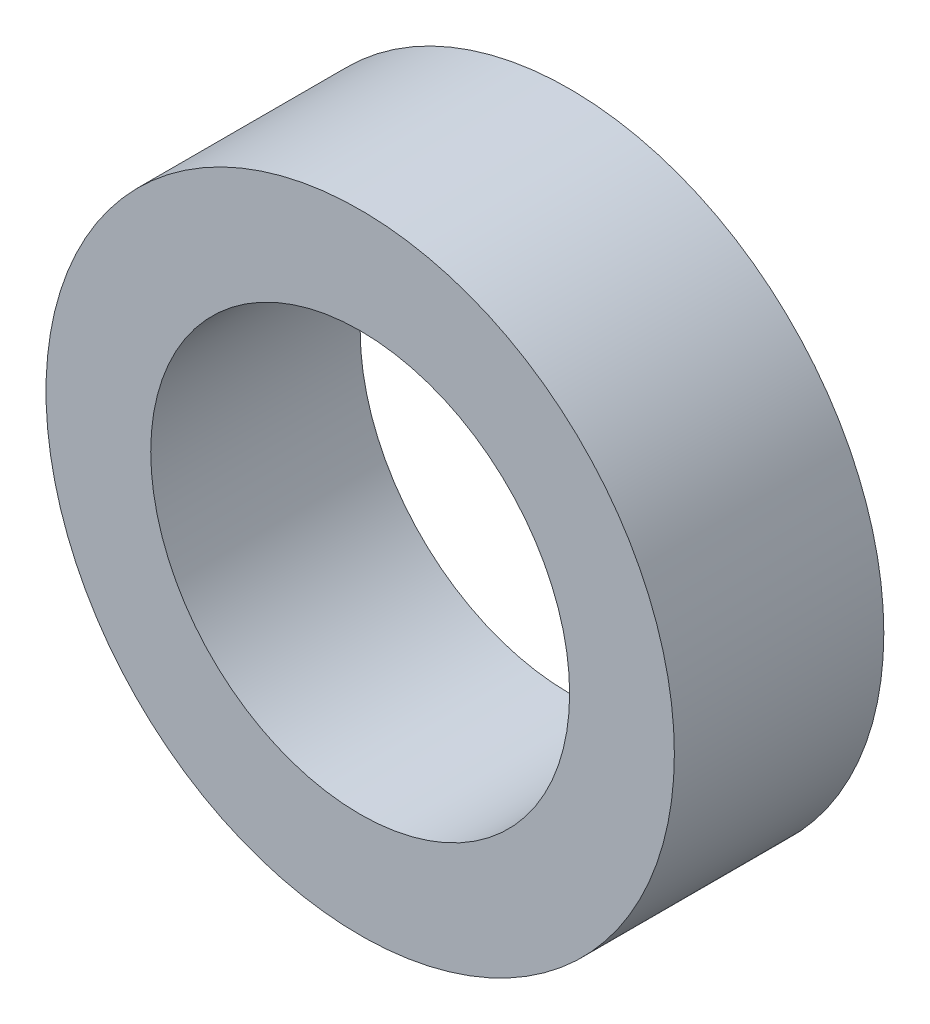
ISO-10303-21;
HEADER;
FILE_DESCRIPTION(('STEP AP214'),'2;1');
FILE_NAME('part.step','',(''),(''),'','','');
FILE_SCHEMA(('AUTOMOTIVE_DESIGN { 1 0 10303 214 1 1 1 1 }'));
ENDSEC;
DATA;
#1=APPLICATION_CONTEXT('core data for automotive mechanical design processes');
#2=APPLICATION_PROTOCOL_DEFINITION('international standard','automotive_design',2000,#1);
#3=PRODUCT_CONTEXT('',#1,'mechanical');
#4=PRODUCT('Part','Part','',(#3));
#5=PRODUCT_RELATED_PRODUCT_CATEGORY('part','',(#4));
#6=PRODUCT_DEFINITION_FORMATION('','',#4);
#7=PRODUCT_DEFINITION_CONTEXT('part definition',#1,'design');
#8=PRODUCT_DEFINITION('design','',#6,#7);
#9=PRODUCT_DEFINITION_SHAPE('','',#8);
#10=(LENGTH_UNIT() NAMED_UNIT(*) SI_UNIT(.MILLI.,.METRE.));
#11=(NAMED_UNIT(*) PLANE_ANGLE_UNIT() SI_UNIT($,.RADIAN.));
#12=(NAMED_UNIT(*) SI_UNIT($,.STERADIAN.) SOLID_ANGLE_UNIT());
#13=UNCERTAINTY_MEASURE_WITH_UNIT(LENGTH_MEASURE(1.E-05),#10,'distance_accuracy_value','');
#14=(GEOMETRIC_REPRESENTATION_CONTEXT(3) GLOBAL_UNCERTAINTY_ASSIGNED_CONTEXT((#13)) GLOBAL_UNIT_ASSIGNED_CONTEXT((#10,
#11,#12)) REPRESENTATION_CONTEXT('',''));
#15=CARTESIAN_POINT('',(0.,0.,0.));
#16=DIRECTION('',(0.,0.,1.));
#17=DIRECTION('',(1.,0.,0.));
#18=AXIS2_PLACEMENT_3D('',#15,#16,#17);
#19=CARTESIAN_POINT('',(0.,0.,2.));
#20=DIRECTION('',(0.,0.,1.));
#21=DIRECTION('',(1.,0.,0.));
#22=AXIS2_PLACEMENT_3D('',#19,#20,#21);
#23=PLANE('',#22);
#24=CARTESIAN_POINT('',(0.,0.,2.));
#25=DIRECTION('',(0.,0.,1.));
#26=DIRECTION('',(1.,0.,0.));
#27=AXIS2_PLACEMENT_3D('',#24,#25,#26);
#28=CIRCLE('',#27,6.);
#29=CARTESIAN_POINT('',(6.,0.,2.));
#30=VERTEX_POINT('',#29);
#31=EDGE_CURVE('E10',#30,#30,#28,.T.);
#32=ORIENTED_EDGE('',*,*,#31,.T.);
#33=EDGE_LOOP('',(#32));
#34=FACE_BOUND('',#33,.T.);
#35=CARTESIAN_POINT('',(0.,0.,2.));
#36=DIRECTION('',(0.,0.,1.));
#37=DIRECTION('',(1.,0.,0.));
#38=AXIS2_PLACEMENT_3D('',#35,#36,#37);
#39=CIRCLE('',#38,4.);
#40=CARTESIAN_POINT('',(4.,0.,2.));
#41=VERTEX_POINT('',#40);
#42=EDGE_CURVE('E41',#41,#41,#39,.T.);
#43=ORIENTED_EDGE('',*,*,#42,.F.);
#44=EDGE_LOOP('',(#43));
#45=FACE_BOUND('',#44,.T.);
#46=ADVANCED_FACE('F30',(#34,#45),#23,.T.);
#47=CARTESIAN_POINT('',(0.,0.,-2.));
#48=DIRECTION('',(0.,0.,1.));
#49=DIRECTION('',(1.,0.,0.));
#50=AXIS2_PLACEMENT_3D('',#47,#48,#49);
#51=PLANE('',#50);
#52=CARTESIAN_POINT('',(0.,0.,-2.));
#53=DIRECTION('',(0.,0.,1.));
#54=DIRECTION('',(1.,0.,0.));
#55=AXIS2_PLACEMENT_3D('',#52,#53,#54);
#56=CIRCLE('',#55,6.);
#57=CARTESIAN_POINT('',(6.,0.,-2.));
#58=VERTEX_POINT('',#57);
#59=EDGE_CURVE('E34',#58,#58,#56,.T.);
#60=ORIENTED_EDGE('',*,*,#59,.F.);
#61=EDGE_LOOP('',(#60));
#62=FACE_BOUND('',#61,.T.);
#63=CARTESIAN_POINT('',(0.,0.,-2.));
#64=DIRECTION('',(0.,0.,1.));
#65=DIRECTION('',(1.,0.,0.));
#66=AXIS2_PLACEMENT_3D('',#63,#64,#65);
#67=CIRCLE('',#66,4.);
#68=CARTESIAN_POINT('',(4.,0.,-2.));
#69=VERTEX_POINT('',#68);
#70=EDGE_CURVE('E43',#69,#69,#67,.T.);
#71=ORIENTED_EDGE('',*,*,#70,.T.);
#72=EDGE_LOOP('',(#71));
#73=FACE_BOUND('',#72,.T.);
#74=ADVANCED_FACE('F53',(#62,#73),#51,.F.);
#75=CARTESIAN_POINT('',(0.,0.,2.));
#76=DIRECTION('',(0.,0.,-1.));
#77=DIRECTION('',(-1.,0.,0.));
#78=AXIS2_PLACEMENT_3D('',#75,#76,#77);
#79=CYLINDRICAL_SURFACE('',#78,6.);
#80=ORIENTED_EDGE('',*,*,#31,.F.);
#81=EDGE_LOOP('',(#80));
#82=FACE_BOUND('',#81,.T.);
#83=ORIENTED_EDGE('',*,*,#59,.T.);
#84=EDGE_LOOP('',(#83));
#85=FACE_BOUND('',#84,.T.);
#86=ADVANCED_FACE('F32',(#82,#85),#79,.T.);
#87=CARTESIAN_POINT('',(0.,0.,2.));
#88=DIRECTION('',(0.,0.,-1.));
#89=DIRECTION('',(-1.,0.,0.));
#90=AXIS2_PLACEMENT_3D('',#87,#88,#89);
#91=CYLINDRICAL_SURFACE('',#90,4.);
#92=ORIENTED_EDGE('',*,*,#42,.T.);
#93=EDGE_LOOP('',(#92));
#94=FACE_BOUND('',#93,.T.);
#95=ORIENTED_EDGE('',*,*,#70,.F.);
#96=EDGE_LOOP('',(#95));
#97=FACE_BOUND('',#96,.T.);
#98=ADVANCED_FACE('F49',(#94,#97),#91,.F.);
#99=CLOSED_SHELL('',(#46,#74,#86,#98));
#100=MANIFOLD_SOLID_BREP('B2',#99);
#101=ADVANCED_BREP_SHAPE_REPRESENTATION('',(#18,#100),#14);
#102=SHAPE_DEFINITION_REPRESENTATION(#9,#101);
ENDSEC;
END-ISO-10303-21;
